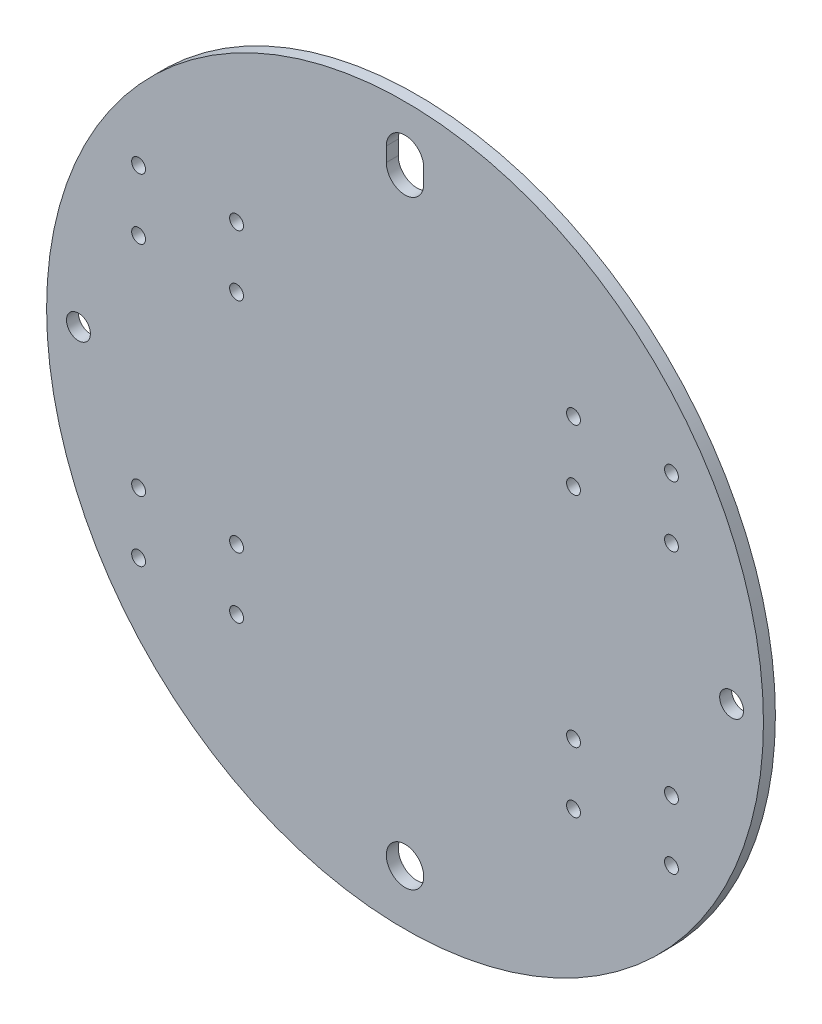
ISO-10303-21;
HEADER;
FILE_DESCRIPTION(('STEP AP214'),'2;1');
FILE_NAME('part.step','',(''),(''),'','','');
FILE_SCHEMA(('AUTOMOTIVE_DESIGN { 1 0 10303 214 1 1 1 1 }'));
ENDSEC;
DATA;
#1=APPLICATION_CONTEXT('core data for automotive mechanical design processes');
#2=APPLICATION_PROTOCOL_DEFINITION('international standard','automotive_design',2000,#1);
#3=PRODUCT_CONTEXT('',#1,'mechanical');
#4=PRODUCT('Part','Part','',(#3));
#5=PRODUCT_RELATED_PRODUCT_CATEGORY('part','',(#4));
#6=PRODUCT_DEFINITION_FORMATION('','',#4);
#7=PRODUCT_DEFINITION_CONTEXT('part definition',#1,'design');
#8=PRODUCT_DEFINITION('design','',#6,#7);
#9=PRODUCT_DEFINITION_SHAPE('','',#8);
#10=(LENGTH_UNIT() NAMED_UNIT(*) SI_UNIT(.MILLI.,.METRE.));
#11=(NAMED_UNIT(*) PLANE_ANGLE_UNIT() SI_UNIT($,.RADIAN.));
#12=(NAMED_UNIT(*) SI_UNIT($,.STERADIAN.) SOLID_ANGLE_UNIT());
#13=UNCERTAINTY_MEASURE_WITH_UNIT(LENGTH_MEASURE(1.E-05),#10,'distance_accuracy_value','');
#14=(GEOMETRIC_REPRESENTATION_CONTEXT(3) GLOBAL_UNCERTAINTY_ASSIGNED_CONTEXT((#13)) GLOBAL_UNIT_ASSIGNED_CONTEXT((#10,
#11,#12)) REPRESENTATION_CONTEXT('',''));
#15=CARTESIAN_POINT('',(0.,0.,0.));
#16=DIRECTION('',(0.,0.,1.));
#17=DIRECTION('',(1.,0.,0.));
#18=AXIS2_PLACEMENT_3D('',#15,#16,#17);
#19=CARTESIAN_POINT('',(0.,0.,4.));
#20=DIRECTION('',(0.,0.,1.));
#21=DIRECTION('',(1.,0.,0.));
#22=AXIS2_PLACEMENT_3D('',#19,#20,#21);
#23=PLANE('',#22);
#24=CARTESIAN_POINT('',(0.,-38.09697969257,4.));
#25=DIRECTION('',(0.,0.,1.));
#26=DIRECTION('',(1.,0.,0.));
#27=AXIS2_PLACEMENT_3D('',#24,#25,#26);
#28=CIRCLE('',#27,2.35);
#29=CARTESIAN_POINT('',(2.35,-38.09697969257,4.));
#30=VERTEX_POINT('',#29);
#31=EDGE_CURVE('E147',#30,#30,#28,.T.);
#32=ORIENTED_EDGE('',*,*,#31,.T.);
#33=EDGE_LOOP('',(#32));
#34=FACE_BOUND('',#33,.T.);
#35=CARTESIAN_POINT('',(0.,37.19697969257,4.));
#36=DIRECTION('',(0.,0.,1.));
#37=DIRECTION('',(1.,0.,0.));
#38=AXIS2_PLACEMENT_3D('',#35,#36,#37);
#39=CIRCLE('',#38,2.35);
#40=CARTESIAN_POINT('',(-2.35,37.19697969257,4.));
#41=VERTEX_POINT('',#40);
#42=CARTESIAN_POINT('',(2.35,37.19697969257,4.));
#43=VERTEX_POINT('',#42);
#44=EDGE_CURVE('E57',#41,#43,#39,.T.);
#45=ORIENTED_EDGE('',*,*,#44,.T.);
#46=DIRECTION('',(0.,1.,0.));
#47=VECTOR('',#46,1.);
#48=CARTESIAN_POINT('',(2.35,37.19697969257,4.));
#49=LINE('',#48,#47);
#50=CARTESIAN_POINT('',(2.35,38.99697969257,4.));
#51=VERTEX_POINT('',#50);
#52=EDGE_CURVE('E60',#43,#51,#49,.T.);
#53=ORIENTED_EDGE('',*,*,#52,.T.);
#54=CARTESIAN_POINT('',(0.,38.99697969257,4.));
#55=DIRECTION('',(0.,0.,1.));
#56=DIRECTION('',(1.,0.,0.));
#57=AXIS2_PLACEMENT_3D('',#54,#55,#56);
#58=CIRCLE('',#57,2.35);
#59=CARTESIAN_POINT('',(-2.35,38.99697969257,4.));
#60=VERTEX_POINT('',#59);
#61=EDGE_CURVE('E150',#51,#60,#58,.T.);
#62=ORIENTED_EDGE('',*,*,#61,.T.);
#63=DIRECTION('',(0.,1.,0.));
#64=VECTOR('',#63,1.);
#65=CARTESIAN_POINT('',(-2.35,38.99697969257,4.));
#66=LINE('',#65,#64);
#67=EDGE_CURVE('E55',#60,#41,#66,.F.);
#68=ORIENTED_EDGE('',*,*,#67,.T.);
#69=EDGE_LOOP('',(#45,#53,#62,#68));
#70=FACE_BOUND('',#69,.T.);
#71=CARTESIAN_POINT('',(-41.,0.,4.));
#72=DIRECTION('',(0.,0.,1.));
#73=DIRECTION('',(1.,0.,0.));
#74=AXIS2_PLACEMENT_3D('',#71,#72,#73);
#75=CIRCLE('',#74,1.5);
#76=CARTESIAN_POINT('',(-39.5,0.,4.));
#77=VERTEX_POINT('',#76);
#78=EDGE_CURVE('E73',#77,#77,#75,.T.);
#79=ORIENTED_EDGE('',*,*,#78,.T.);
#80=EDGE_LOOP('',(#79));
#81=FACE_BOUND('',#80,.T.);
#82=CARTESIAN_POINT('',(41.,0.,4.));
#83=DIRECTION('',(0.,0.,1.));
#84=DIRECTION('',(1.,0.,0.));
#85=AXIS2_PLACEMENT_3D('',#82,#83,#84);
#86=CIRCLE('',#85,1.5);
#87=CARTESIAN_POINT('',(42.5,0.,4.));
#88=VERTEX_POINT('',#87);
#89=EDGE_CURVE('E154',#88,#88,#86,.T.);
#90=ORIENTED_EDGE('',*,*,#89,.T.);
#91=EDGE_LOOP('',(#90));
#92=FACE_BOUND('',#91,.T.);
#93=CARTESIAN_POINT('',(-33.45,13.715,4.));
#94=DIRECTION('',(0.,0.,1.));
#95=DIRECTION('',(1.,0.,0.));
#96=AXIS2_PLACEMENT_3D('',#93,#94,#95);
#97=CIRCLE('',#96,0.87);
#98=CARTESIAN_POINT('',(-32.58,13.715,4.));
#99=VERTEX_POINT('',#98);
#100=EDGE_CURVE('E157',#99,#99,#97,.T.);
#101=ORIENTED_EDGE('',*,*,#100,.T.);
#102=EDGE_LOOP('',(#101));
#103=FACE_BOUND('',#102,.T.);
#104=CARTESIAN_POINT('',(-33.45,21.335,4.));
#105=DIRECTION('',(0.,0.,1.));
#106=DIRECTION('',(1.,0.,0.));
#107=AXIS2_PLACEMENT_3D('',#104,#105,#106);
#108=CIRCLE('',#107,0.87);
#109=CARTESIAN_POINT('',(-32.58,21.335,4.));
#110=VERTEX_POINT('',#109);
#111=EDGE_CURVE('E160',#110,#110,#108,.T.);
#112=ORIENTED_EDGE('',*,*,#111,.T.);
#113=EDGE_LOOP('',(#112));
#114=FACE_BOUND('',#113,.T.);
#115=CARTESIAN_POINT('',(-21.15,13.715,4.));
#116=DIRECTION('',(0.,0.,1.));
#117=DIRECTION('',(1.,0.,0.));
#118=AXIS2_PLACEMENT_3D('',#115,#116,#117);
#119=CIRCLE('',#118,0.87);
#120=CARTESIAN_POINT('',(-20.28,13.715,4.));
#121=VERTEX_POINT('',#120);
#122=EDGE_CURVE('E163',#121,#121,#119,.T.);
#123=ORIENTED_EDGE('',*,*,#122,.T.);
#124=EDGE_LOOP('',(#123));
#125=FACE_BOUND('',#124,.T.);
#126=CARTESIAN_POINT('',(-21.15,21.335,4.));
#127=DIRECTION('',(0.,0.,1.));
#128=DIRECTION('',(1.,0.,0.));
#129=AXIS2_PLACEMENT_3D('',#126,#127,#128);
#130=CIRCLE('',#129,0.87);
#131=CARTESIAN_POINT('',(-20.28,21.335,4.));
#132=VERTEX_POINT('',#131);
#133=EDGE_CURVE('E166',#132,#132,#130,.T.);
#134=ORIENTED_EDGE('',*,*,#133,.T.);
#135=EDGE_LOOP('',(#134));
#136=FACE_BOUND('',#135,.T.);
#137=CARTESIAN_POINT('',(-33.45,-13.715,4.));
#138=DIRECTION('',(0.,0.,1.));
#139=DIRECTION('',(1.,0.,0.));
#140=AXIS2_PLACEMENT_3D('',#137,#138,#139);
#141=CIRCLE('',#140,0.87);
#142=CARTESIAN_POINT('',(-32.58,-13.715,4.));
#143=VERTEX_POINT('',#142);
#144=EDGE_CURVE('E169',#143,#143,#141,.T.);
#145=ORIENTED_EDGE('',*,*,#144,.T.);
#146=EDGE_LOOP('',(#145));
#147=FACE_BOUND('',#146,.T.);
#148=CARTESIAN_POINT('',(-33.45,-21.335,4.));
#149=DIRECTION('',(0.,0.,1.));
#150=DIRECTION('',(1.,0.,0.));
#151=AXIS2_PLACEMENT_3D('',#148,#149,#150);
#152=CIRCLE('',#151,0.87);
#153=CARTESIAN_POINT('',(-32.58,-21.335,4.));
#154=VERTEX_POINT('',#153);
#155=EDGE_CURVE('E172',#154,#154,#152,.T.);
#156=ORIENTED_EDGE('',*,*,#155,.T.);
#157=EDGE_LOOP('',(#156));
#158=FACE_BOUND('',#157,.T.);
#159=CARTESIAN_POINT('',(-21.15,-13.715,4.));
#160=DIRECTION('',(0.,0.,1.));
#161=DIRECTION('',(1.,0.,0.));
#162=AXIS2_PLACEMENT_3D('',#159,#160,#161);
#163=CIRCLE('',#162,0.87);
#164=CARTESIAN_POINT('',(-20.28,-13.715,4.));
#165=VERTEX_POINT('',#164);
#166=EDGE_CURVE('E175',#165,#165,#163,.T.);
#167=ORIENTED_EDGE('',*,*,#166,.T.);
#168=EDGE_LOOP('',(#167));
#169=FACE_BOUND('',#168,.T.);
#170=CARTESIAN_POINT('',(-21.15,-21.335,4.));
#171=DIRECTION('',(0.,0.,1.));
#172=DIRECTION('',(1.,0.,0.));
#173=AXIS2_PLACEMENT_3D('',#170,#171,#172);
#174=CIRCLE('',#173,0.87);
#175=CARTESIAN_POINT('',(-20.28,-21.335,4.));
#176=VERTEX_POINT('',#175);
#177=EDGE_CURVE('E178',#176,#176,#174,.T.);
#178=ORIENTED_EDGE('',*,*,#177,.T.);
#179=EDGE_LOOP('',(#178));
#180=FACE_BOUND('',#179,.T.);
#181=CARTESIAN_POINT('',(33.45,13.715,4.));
#182=DIRECTION('',(0.,0.,1.));
#183=DIRECTION('',(1.,0.,0.));
#184=AXIS2_PLACEMENT_3D('',#181,#182,#183);
#185=CIRCLE('',#184,0.87);
#186=CARTESIAN_POINT('',(34.32,13.715,4.));
#187=VERTEX_POINT('',#186);
#188=EDGE_CURVE('E181',#187,#187,#185,.T.);
#189=ORIENTED_EDGE('',*,*,#188,.T.);
#190=EDGE_LOOP('',(#189));
#191=FACE_BOUND('',#190,.T.);
#192=CARTESIAN_POINT('',(33.45,21.335,4.));
#193=DIRECTION('',(0.,0.,1.));
#194=DIRECTION('',(1.,0.,0.));
#195=AXIS2_PLACEMENT_3D('',#192,#193,#194);
#196=CIRCLE('',#195,0.87);
#197=CARTESIAN_POINT('',(34.32,21.335,4.));
#198=VERTEX_POINT('',#197);
#199=EDGE_CURVE('E184',#198,#198,#196,.T.);
#200=ORIENTED_EDGE('',*,*,#199,.T.);
#201=EDGE_LOOP('',(#200));
#202=FACE_BOUND('',#201,.T.);
#203=CARTESIAN_POINT('',(21.15,13.715,4.));
#204=DIRECTION('',(0.,0.,1.));
#205=DIRECTION('',(1.,0.,0.));
#206=AXIS2_PLACEMENT_3D('',#203,#204,#205);
#207=CIRCLE('',#206,0.87);
#208=CARTESIAN_POINT('',(22.02,13.715,4.));
#209=VERTEX_POINT('',#208);
#210=EDGE_CURVE('E187',#209,#209,#207,.T.);
#211=ORIENTED_EDGE('',*,*,#210,.T.);
#212=EDGE_LOOP('',(#211));
#213=FACE_BOUND('',#212,.T.);
#214=CARTESIAN_POINT('',(21.15,21.335,4.));
#215=DIRECTION('',(0.,0.,1.));
#216=DIRECTION('',(1.,0.,0.));
#217=AXIS2_PLACEMENT_3D('',#214,#215,#216);
#218=CIRCLE('',#217,0.87);
#219=CARTESIAN_POINT('',(22.02,21.335,4.));
#220=VERTEX_POINT('',#219);
#221=EDGE_CURVE('E190',#220,#220,#218,.T.);
#222=ORIENTED_EDGE('',*,*,#221,.T.);
#223=EDGE_LOOP('',(#222));
#224=FACE_BOUND('',#223,.T.);
#225=CARTESIAN_POINT('',(33.45,-13.715,4.));
#226=DIRECTION('',(0.,0.,1.));
#227=DIRECTION('',(1.,0.,0.));
#228=AXIS2_PLACEMENT_3D('',#225,#226,#227);
#229=CIRCLE('',#228,0.87);
#230=CARTESIAN_POINT('',(34.32,-13.715,4.));
#231=VERTEX_POINT('',#230);
#232=EDGE_CURVE('E193',#231,#231,#229,.T.);
#233=ORIENTED_EDGE('',*,*,#232,.T.);
#234=EDGE_LOOP('',(#233));
#235=FACE_BOUND('',#234,.T.);
#236=CARTESIAN_POINT('',(33.45,-21.335,4.));
#237=DIRECTION('',(0.,0.,1.));
#238=DIRECTION('',(1.,0.,0.));
#239=AXIS2_PLACEMENT_3D('',#236,#237,#238);
#240=CIRCLE('',#239,0.87);
#241=CARTESIAN_POINT('',(34.32,-21.335,4.));
#242=VERTEX_POINT('',#241);
#243=EDGE_CURVE('E196',#242,#242,#240,.T.);
#244=ORIENTED_EDGE('',*,*,#243,.T.);
#245=EDGE_LOOP('',(#244));
#246=FACE_BOUND('',#245,.T.);
#247=CARTESIAN_POINT('',(21.15,-13.715,4.));
#248=DIRECTION('',(0.,0.,1.));
#249=DIRECTION('',(1.,0.,0.));
#250=AXIS2_PLACEMENT_3D('',#247,#248,#249);
#251=CIRCLE('',#250,0.87);
#252=CARTESIAN_POINT('',(22.02,-13.715,4.));
#253=VERTEX_POINT('',#252);
#254=EDGE_CURVE('E199',#253,#253,#251,.T.);
#255=ORIENTED_EDGE('',*,*,#254,.T.);
#256=EDGE_LOOP('',(#255));
#257=FACE_BOUND('',#256,.T.);
#258=CARTESIAN_POINT('',(21.15,-21.335,4.));
#259=DIRECTION('',(0.,0.,1.));
#260=DIRECTION('',(1.,0.,0.));
#261=AXIS2_PLACEMENT_3D('',#258,#259,#260);
#262=CIRCLE('',#261,0.87);
#263=CARTESIAN_POINT('',(22.02,-21.335,4.));
#264=VERTEX_POINT('',#263);
#265=EDGE_CURVE('E201',#264,#264,#262,.T.);
#266=ORIENTED_EDGE('',*,*,#265,.T.);
#267=EDGE_LOOP('',(#266));
#268=FACE_BOUND('',#267,.T.);
#269=CARTESIAN_POINT('',(0.,0.,4.));
#270=DIRECTION('',(0.,0.,1.));
#271=DIRECTION('',(1.,0.,0.));
#272=AXIS2_PLACEMENT_3D('',#269,#270,#271);
#273=CIRCLE('',#272,45.);
#274=CARTESIAN_POINT('',(45.,0.,4.));
#275=VERTEX_POINT('',#274);
#276=EDGE_CURVE('E20',#275,#275,#273,.T.);
#277=ORIENTED_EDGE('',*,*,#276,.F.);
#278=EDGE_LOOP('',(#277));
#279=FACE_BOUND('',#278,.T.);
#280=ADVANCED_FACE('F17',(#34,#70,#81,#92,#103,#114,#125,#136,#147,#158,#169,#180,#191,#202,
#213,#224,#235,#246,#257,#268,#279),#23,.F.);
#281=CARTESIAN_POINT('',(0.,0.,5.5));
#282=DIRECTION('',(0.,0.,1.));
#283=DIRECTION('',(1.,0.,0.));
#284=AXIS2_PLACEMENT_3D('',#281,#282,#283);
#285=CYLINDRICAL_SURFACE('',#284,45.);
#286=ORIENTED_EDGE('',*,*,#276,.T.);
#287=EDGE_LOOP('',(#286));
#288=FACE_BOUND('',#287,.T.);
#289=CARTESIAN_POINT('',(0.,0.,5.5));
#290=DIRECTION('',(0.,0.,1.));
#291=DIRECTION('',(1.,0.,0.));
#292=AXIS2_PLACEMENT_3D('',#289,#290,#291);
#293=CIRCLE('',#292,45.);
#294=CARTESIAN_POINT('',(45.,0.,5.5));
#295=VERTEX_POINT('',#294);
#296=EDGE_CURVE('E144',#295,#295,#293,.T.);
#297=ORIENTED_EDGE('',*,*,#296,.F.);
#298=EDGE_LOOP('',(#297));
#299=FACE_BOUND('',#298,.T.);
#300=ADVANCED_FACE('F208',(#288,#299),#285,.T.);
#301=CARTESIAN_POINT('',(21.15,-21.335,5.5));
#302=DIRECTION('',(0.,0.,1.));
#303=DIRECTION('',(1.,0.,0.));
#304=AXIS2_PLACEMENT_3D('',#301,#302,#303);
#305=CYLINDRICAL_SURFACE('',#304,0.87);
#306=ORIENTED_EDGE('',*,*,#265,.F.);
#307=EDGE_LOOP('',(#306));
#308=FACE_BOUND('',#307,.T.);
#309=CARTESIAN_POINT('',(21.15,-21.335,5.5));
#310=DIRECTION('',(0.,0.,1.));
#311=DIRECTION('',(1.,0.,0.));
#312=AXIS2_PLACEMENT_3D('',#309,#310,#311);
#313=CIRCLE('',#312,0.87);
#314=CARTESIAN_POINT('',(22.02,-21.335,5.5));
#315=VERTEX_POINT('',#314);
#316=EDGE_CURVE('E141',#315,#315,#313,.F.);
#317=ORIENTED_EDGE('',*,*,#316,.F.);
#318=EDGE_LOOP('',(#317));
#319=FACE_BOUND('',#318,.T.);
#320=ADVANCED_FACE('F217',(#308,#319),#305,.F.);
#321=CARTESIAN_POINT('',(21.15,-13.715,5.5));
#322=DIRECTION('',(0.,0.,1.));
#323=DIRECTION('',(1.,0.,0.));
#324=AXIS2_PLACEMENT_3D('',#321,#322,#323);
#325=CYLINDRICAL_SURFACE('',#324,0.87);
#326=ORIENTED_EDGE('',*,*,#254,.F.);
#327=EDGE_LOOP('',(#326));
#328=FACE_BOUND('',#327,.T.);
#329=CARTESIAN_POINT('',(21.15,-13.715,5.5));
#330=DIRECTION('',(0.,0.,1.));
#331=DIRECTION('',(1.,0.,0.));
#332=AXIS2_PLACEMENT_3D('',#329,#330,#331);
#333=CIRCLE('',#332,0.87);
#334=CARTESIAN_POINT('',(22.02,-13.715,5.5));
#335=VERTEX_POINT('',#334);
#336=EDGE_CURVE('E138',#335,#335,#333,.F.);
#337=ORIENTED_EDGE('',*,*,#336,.F.);
#338=EDGE_LOOP('',(#337));
#339=FACE_BOUND('',#338,.T.);
#340=ADVANCED_FACE('F304',(#328,#339),#325,.F.);
#341=CARTESIAN_POINT('',(33.45,-21.335,5.5));
#342=DIRECTION('',(0.,0.,1.));
#343=DIRECTION('',(1.,0.,0.));
#344=AXIS2_PLACEMENT_3D('',#341,#342,#343);
#345=CYLINDRICAL_SURFACE('',#344,0.87);
#346=ORIENTED_EDGE('',*,*,#243,.F.);
#347=EDGE_LOOP('',(#346));
#348=FACE_BOUND('',#347,.T.);
#349=CARTESIAN_POINT('',(33.45,-21.335,5.5));
#350=DIRECTION('',(0.,0.,1.));
#351=DIRECTION('',(1.,0.,0.));
#352=AXIS2_PLACEMENT_3D('',#349,#350,#351);
#353=CIRCLE('',#352,0.87);
#354=CARTESIAN_POINT('',(34.32,-21.335,5.5));
#355=VERTEX_POINT('',#354);
#356=EDGE_CURVE('E135',#355,#355,#353,.F.);
#357=ORIENTED_EDGE('',*,*,#356,.F.);
#358=EDGE_LOOP('',(#357));
#359=FACE_BOUND('',#358,.T.);
#360=ADVANCED_FACE('F300',(#348,#359),#345,.F.);
#361=CARTESIAN_POINT('',(33.45,-13.715,5.5));
#362=DIRECTION('',(0.,0.,1.));
#363=DIRECTION('',(1.,0.,0.));
#364=AXIS2_PLACEMENT_3D('',#361,#362,#363);
#365=CYLINDRICAL_SURFACE('',#364,0.87);
#366=ORIENTED_EDGE('',*,*,#232,.F.);
#367=EDGE_LOOP('',(#366));
#368=FACE_BOUND('',#367,.T.);
#369=CARTESIAN_POINT('',(33.45,-13.715,5.5));
#370=DIRECTION('',(0.,0.,1.));
#371=DIRECTION('',(1.,0.,0.));
#372=AXIS2_PLACEMENT_3D('',#369,#370,#371);
#373=CIRCLE('',#372,0.87);
#374=CARTESIAN_POINT('',(34.32,-13.715,5.5));
#375=VERTEX_POINT('',#374);
#376=EDGE_CURVE('E132',#375,#375,#373,.F.);
#377=ORIENTED_EDGE('',*,*,#376,.F.);
#378=EDGE_LOOP('',(#377));
#379=FACE_BOUND('',#378,.T.);
#380=ADVANCED_FACE('F296',(#368,#379),#365,.F.);
#381=CARTESIAN_POINT('',(21.15,21.335,5.5));
#382=DIRECTION('',(0.,0.,1.));
#383=DIRECTION('',(1.,0.,0.));
#384=AXIS2_PLACEMENT_3D('',#381,#382,#383);
#385=CYLINDRICAL_SURFACE('',#384,0.87);
#386=ORIENTED_EDGE('',*,*,#221,.F.);
#387=EDGE_LOOP('',(#386));
#388=FACE_BOUND('',#387,.T.);
#389=CARTESIAN_POINT('',(21.15,21.335,5.5));
#390=DIRECTION('',(0.,0.,1.));
#391=DIRECTION('',(1.,0.,0.));
#392=AXIS2_PLACEMENT_3D('',#389,#390,#391);
#393=CIRCLE('',#392,0.87);
#394=CARTESIAN_POINT('',(22.02,21.335,5.5));
#395=VERTEX_POINT('',#394);
#396=EDGE_CURVE('E129',#395,#395,#393,.F.);
#397=ORIENTED_EDGE('',*,*,#396,.F.);
#398=EDGE_LOOP('',(#397));
#399=FACE_BOUND('',#398,.T.);
#400=ADVANCED_FACE('F292',(#388,#399),#385,.F.);
#401=CARTESIAN_POINT('',(21.15,13.715,5.5));
#402=DIRECTION('',(0.,0.,1.));
#403=DIRECTION('',(1.,0.,0.));
#404=AXIS2_PLACEMENT_3D('',#401,#402,#403);
#405=CYLINDRICAL_SURFACE('',#404,0.87);
#406=ORIENTED_EDGE('',*,*,#210,.F.);
#407=EDGE_LOOP('',(#406));
#408=FACE_BOUND('',#407,.T.);
#409=CARTESIAN_POINT('',(21.15,13.715,5.5));
#410=DIRECTION('',(0.,0.,1.));
#411=DIRECTION('',(1.,0.,0.));
#412=AXIS2_PLACEMENT_3D('',#409,#410,#411);
#413=CIRCLE('',#412,0.87);
#414=CARTESIAN_POINT('',(22.02,13.715,5.5));
#415=VERTEX_POINT('',#414);
#416=EDGE_CURVE('E126',#415,#415,#413,.F.);
#417=ORIENTED_EDGE('',*,*,#416,.F.);
#418=EDGE_LOOP('',(#417));
#419=FACE_BOUND('',#418,.T.);
#420=ADVANCED_FACE('F288',(#408,#419),#405,.F.);
#421=CARTESIAN_POINT('',(33.45,21.335,5.5));
#422=DIRECTION('',(0.,0.,1.));
#423=DIRECTION('',(1.,0.,0.));
#424=AXIS2_PLACEMENT_3D('',#421,#422,#423);
#425=CYLINDRICAL_SURFACE('',#424,0.87);
#426=ORIENTED_EDGE('',*,*,#199,.F.);
#427=EDGE_LOOP('',(#426));
#428=FACE_BOUND('',#427,.T.);
#429=CARTESIAN_POINT('',(33.45,21.335,5.5));
#430=DIRECTION('',(0.,0.,1.));
#431=DIRECTION('',(1.,0.,0.));
#432=AXIS2_PLACEMENT_3D('',#429,#430,#431);
#433=CIRCLE('',#432,0.87);
#434=CARTESIAN_POINT('',(34.32,21.335,5.5));
#435=VERTEX_POINT('',#434);
#436=EDGE_CURVE('E123',#435,#435,#433,.F.);
#437=ORIENTED_EDGE('',*,*,#436,.F.);
#438=EDGE_LOOP('',(#437));
#439=FACE_BOUND('',#438,.T.);
#440=ADVANCED_FACE('F284',(#428,#439),#425,.F.);
#441=CARTESIAN_POINT('',(33.45,13.715,5.5));
#442=DIRECTION('',(0.,0.,1.));
#443=DIRECTION('',(1.,0.,0.));
#444=AXIS2_PLACEMENT_3D('',#441,#442,#443);
#445=CYLINDRICAL_SURFACE('',#444,0.87);
#446=ORIENTED_EDGE('',*,*,#188,.F.);
#447=EDGE_LOOP('',(#446));
#448=FACE_BOUND('',#447,.T.);
#449=CARTESIAN_POINT('',(33.45,13.715,5.5));
#450=DIRECTION('',(0.,0.,1.));
#451=DIRECTION('',(1.,0.,0.));
#452=AXIS2_PLACEMENT_3D('',#449,#450,#451);
#453=CIRCLE('',#452,0.87);
#454=CARTESIAN_POINT('',(34.32,13.715,5.5));
#455=VERTEX_POINT('',#454);
#456=EDGE_CURVE('E120',#455,#455,#453,.F.);
#457=ORIENTED_EDGE('',*,*,#456,.F.);
#458=EDGE_LOOP('',(#457));
#459=FACE_BOUND('',#458,.T.);
#460=ADVANCED_FACE('F280',(#448,#459),#445,.F.);
#461=CARTESIAN_POINT('',(-21.15,-21.335,5.5));
#462=DIRECTION('',(0.,0.,1.));
#463=DIRECTION('',(1.,0.,0.));
#464=AXIS2_PLACEMENT_3D('',#461,#462,#463);
#465=CYLINDRICAL_SURFACE('',#464,0.87);
#466=ORIENTED_EDGE('',*,*,#177,.F.);
#467=EDGE_LOOP('',(#466));
#468=FACE_BOUND('',#467,.T.);
#469=CARTESIAN_POINT('',(-21.15,-21.335,5.5));
#470=DIRECTION('',(0.,0.,1.));
#471=DIRECTION('',(1.,0.,0.));
#472=AXIS2_PLACEMENT_3D('',#469,#470,#471);
#473=CIRCLE('',#472,0.87);
#474=CARTESIAN_POINT('',(-20.28,-21.335,5.5));
#475=VERTEX_POINT('',#474);
#476=EDGE_CURVE('E117',#475,#475,#473,.F.);
#477=ORIENTED_EDGE('',*,*,#476,.F.);
#478=EDGE_LOOP('',(#477));
#479=FACE_BOUND('',#478,.T.);
#480=ADVANCED_FACE('F276',(#468,#479),#465,.F.);
#481=CARTESIAN_POINT('',(-21.15,-13.715,5.5));
#482=DIRECTION('',(0.,0.,1.));
#483=DIRECTION('',(1.,0.,0.));
#484=AXIS2_PLACEMENT_3D('',#481,#482,#483);
#485=CYLINDRICAL_SURFACE('',#484,0.87);
#486=ORIENTED_EDGE('',*,*,#166,.F.);
#487=EDGE_LOOP('',(#486));
#488=FACE_BOUND('',#487,.T.);
#489=CARTESIAN_POINT('',(-21.15,-13.715,5.5));
#490=DIRECTION('',(0.,0.,1.));
#491=DIRECTION('',(1.,0.,0.));
#492=AXIS2_PLACEMENT_3D('',#489,#490,#491);
#493=CIRCLE('',#492,0.87);
#494=CARTESIAN_POINT('',(-20.28,-13.715,5.5));
#495=VERTEX_POINT('',#494);
#496=EDGE_CURVE('E114',#495,#495,#493,.F.);
#497=ORIENTED_EDGE('',*,*,#496,.F.);
#498=EDGE_LOOP('',(#497));
#499=FACE_BOUND('',#498,.T.);
#500=ADVANCED_FACE('F272',(#488,#499),#485,.F.);
#501=CARTESIAN_POINT('',(-33.45,-21.335,5.5));
#502=DIRECTION('',(0.,0.,1.));
#503=DIRECTION('',(1.,0.,0.));
#504=AXIS2_PLACEMENT_3D('',#501,#502,#503);
#505=CYLINDRICAL_SURFACE('',#504,0.87);
#506=ORIENTED_EDGE('',*,*,#155,.F.);
#507=EDGE_LOOP('',(#506));
#508=FACE_BOUND('',#507,.T.);
#509=CARTESIAN_POINT('',(-33.45,-21.335,5.5));
#510=DIRECTION('',(0.,0.,1.));
#511=DIRECTION('',(1.,0.,0.));
#512=AXIS2_PLACEMENT_3D('',#509,#510,#511);
#513=CIRCLE('',#512,0.87);
#514=CARTESIAN_POINT('',(-32.58,-21.335,5.5));
#515=VERTEX_POINT('',#514);
#516=EDGE_CURVE('E111',#515,#515,#513,.F.);
#517=ORIENTED_EDGE('',*,*,#516,.F.);
#518=EDGE_LOOP('',(#517));
#519=FACE_BOUND('',#518,.T.);
#520=ADVANCED_FACE('F268',(#508,#519),#505,.F.);
#521=CARTESIAN_POINT('',(-33.45,-13.715,5.5));
#522=DIRECTION('',(0.,0.,1.));
#523=DIRECTION('',(1.,0.,0.));
#524=AXIS2_PLACEMENT_3D('',#521,#522,#523);
#525=CYLINDRICAL_SURFACE('',#524,0.87);
#526=ORIENTED_EDGE('',*,*,#144,.F.);
#527=EDGE_LOOP('',(#526));
#528=FACE_BOUND('',#527,.T.);
#529=CARTESIAN_POINT('',(-33.45,-13.715,5.5));
#530=DIRECTION('',(0.,0.,1.));
#531=DIRECTION('',(1.,0.,0.));
#532=AXIS2_PLACEMENT_3D('',#529,#530,#531);
#533=CIRCLE('',#532,0.87);
#534=CARTESIAN_POINT('',(-32.58,-13.715,5.5));
#535=VERTEX_POINT('',#534);
#536=EDGE_CURVE('E108',#535,#535,#533,.F.);
#537=ORIENTED_EDGE('',*,*,#536,.F.);
#538=EDGE_LOOP('',(#537));
#539=FACE_BOUND('',#538,.T.);
#540=ADVANCED_FACE('F264',(#528,#539),#525,.F.);
#541=CARTESIAN_POINT('',(-21.15,21.335,5.5));
#542=DIRECTION('',(0.,0.,1.));
#543=DIRECTION('',(1.,0.,0.));
#544=AXIS2_PLACEMENT_3D('',#541,#542,#543);
#545=CYLINDRICAL_SURFACE('',#544,0.87);
#546=ORIENTED_EDGE('',*,*,#133,.F.);
#547=EDGE_LOOP('',(#546));
#548=FACE_BOUND('',#547,.T.);
#549=CARTESIAN_POINT('',(-21.15,21.335,5.5));
#550=DIRECTION('',(0.,0.,1.));
#551=DIRECTION('',(1.,0.,0.));
#552=AXIS2_PLACEMENT_3D('',#549,#550,#551);
#553=CIRCLE('',#552,0.87);
#554=CARTESIAN_POINT('',(-20.28,21.335,5.5));
#555=VERTEX_POINT('',#554);
#556=EDGE_CURVE('E105',#555,#555,#553,.F.);
#557=ORIENTED_EDGE('',*,*,#556,.F.);
#558=EDGE_LOOP('',(#557));
#559=FACE_BOUND('',#558,.T.);
#560=ADVANCED_FACE('F260',(#548,#559),#545,.F.);
#561=CARTESIAN_POINT('',(-21.15,13.715,5.5));
#562=DIRECTION('',(0.,0.,1.));
#563=DIRECTION('',(1.,0.,0.));
#564=AXIS2_PLACEMENT_3D('',#561,#562,#563);
#565=CYLINDRICAL_SURFACE('',#564,0.87);
#566=ORIENTED_EDGE('',*,*,#122,.F.);
#567=EDGE_LOOP('',(#566));
#568=FACE_BOUND('',#567,.T.);
#569=CARTESIAN_POINT('',(-21.15,13.715,5.5));
#570=DIRECTION('',(0.,0.,1.));
#571=DIRECTION('',(1.,0.,0.));
#572=AXIS2_PLACEMENT_3D('',#569,#570,#571);
#573=CIRCLE('',#572,0.87);
#574=CARTESIAN_POINT('',(-20.28,13.715,5.5));
#575=VERTEX_POINT('',#574);
#576=EDGE_CURVE('E102',#575,#575,#573,.F.);
#577=ORIENTED_EDGE('',*,*,#576,.F.);
#578=EDGE_LOOP('',(#577));
#579=FACE_BOUND('',#578,.T.);
#580=ADVANCED_FACE('F256',(#568,#579),#565,.F.);
#581=CARTESIAN_POINT('',(-33.45,21.335,5.5));
#582=DIRECTION('',(0.,0.,1.));
#583=DIRECTION('',(1.,0.,0.));
#584=AXIS2_PLACEMENT_3D('',#581,#582,#583);
#585=CYLINDRICAL_SURFACE('',#584,0.87);
#586=ORIENTED_EDGE('',*,*,#111,.F.);
#587=EDGE_LOOP('',(#586));
#588=FACE_BOUND('',#587,.T.);
#589=CARTESIAN_POINT('',(-33.45,21.335,5.5));
#590=DIRECTION('',(0.,0.,1.));
#591=DIRECTION('',(1.,0.,0.));
#592=AXIS2_PLACEMENT_3D('',#589,#590,#591);
#593=CIRCLE('',#592,0.87);
#594=CARTESIAN_POINT('',(-32.58,21.335,5.5));
#595=VERTEX_POINT('',#594);
#596=EDGE_CURVE('E99',#595,#595,#593,.F.);
#597=ORIENTED_EDGE('',*,*,#596,.F.);
#598=EDGE_LOOP('',(#597));
#599=FACE_BOUND('',#598,.T.);
#600=ADVANCED_FACE('F252',(#588,#599),#585,.F.);
#601=CARTESIAN_POINT('',(-33.45,13.715,5.5));
#602=DIRECTION('',(0.,0.,1.));
#603=DIRECTION('',(1.,0.,0.));
#604=AXIS2_PLACEMENT_3D('',#601,#602,#603);
#605=CYLINDRICAL_SURFACE('',#604,0.87);
#606=ORIENTED_EDGE('',*,*,#100,.F.);
#607=EDGE_LOOP('',(#606));
#608=FACE_BOUND('',#607,.T.);
#609=CARTESIAN_POINT('',(-33.45,13.715,5.5));
#610=DIRECTION('',(0.,0.,1.));
#611=DIRECTION('',(1.,0.,0.));
#612=AXIS2_PLACEMENT_3D('',#609,#610,#611);
#613=CIRCLE('',#612,0.87);
#614=CARTESIAN_POINT('',(-32.58,13.715,5.5));
#615=VERTEX_POINT('',#614);
#616=EDGE_CURVE('E96',#615,#615,#613,.F.);
#617=ORIENTED_EDGE('',*,*,#616,.F.);
#618=EDGE_LOOP('',(#617));
#619=FACE_BOUND('',#618,.T.);
#620=ADVANCED_FACE('F248',(#608,#619),#605,.F.);
#621=CARTESIAN_POINT('',(41.,0.,8.5));
#622=DIRECTION('',(0.,0.,1.));
#623=DIRECTION('',(1.,0.,0.));
#624=AXIS2_PLACEMENT_3D('',#621,#622,#623);
#625=CYLINDRICAL_SURFACE('',#624,1.5);
#626=ORIENTED_EDGE('',*,*,#89,.F.);
#627=EDGE_LOOP('',(#626));
#628=FACE_BOUND('',#627,.T.);
#629=CARTESIAN_POINT('',(41.,0.,5.5));
#630=DIRECTION('',(0.,0.,1.));
#631=DIRECTION('',(1.,0.,0.));
#632=AXIS2_PLACEMENT_3D('',#629,#630,#631);
#633=CIRCLE('',#632,1.5);
#634=CARTESIAN_POINT('',(42.5,0.,5.5));
#635=VERTEX_POINT('',#634);
#636=EDGE_CURVE('E93',#635,#635,#633,.F.);
#637=ORIENTED_EDGE('',*,*,#636,.F.);
#638=EDGE_LOOP('',(#637));
#639=FACE_BOUND('',#638,.T.);
#640=ADVANCED_FACE('F244',(#628,#639),#625,.F.);
#641=CARTESIAN_POINT('',(-41.,0.,8.5));
#642=DIRECTION('',(0.,0.,1.));
#643=DIRECTION('',(1.,0.,0.));
#644=AXIS2_PLACEMENT_3D('',#641,#642,#643);
#645=CYLINDRICAL_SURFACE('',#644,1.5);
#646=ORIENTED_EDGE('',*,*,#78,.F.);
#647=EDGE_LOOP('',(#646));
#648=FACE_BOUND('',#647,.T.);
#649=CARTESIAN_POINT('',(-41.,0.,5.5));
#650=DIRECTION('',(0.,0.,1.));
#651=DIRECTION('',(1.,0.,0.));
#652=AXIS2_PLACEMENT_3D('',#649,#650,#651);
#653=CIRCLE('',#652,1.5);
#654=CARTESIAN_POINT('',(-39.5,0.,5.5));
#655=VERTEX_POINT('',#654);
#656=EDGE_CURVE('E90',#655,#655,#653,.F.);
#657=ORIENTED_EDGE('',*,*,#656,.F.);
#658=EDGE_LOOP('',(#657));
#659=FACE_BOUND('',#658,.T.);
#660=ADVANCED_FACE('F241',(#648,#659),#645,.F.);
#661=CARTESIAN_POINT('',(2.35,37.19697969257,8.5));
#662=DIRECTION('',(1.,0.,0.));
#663=DIRECTION('',(0.,0.,-1.));
#664=AXIS2_PLACEMENT_3D('',#661,#662,#663);
#665=PLANE('',#664);
#666=ORIENTED_EDGE('',*,*,#52,.F.);
#667=DIRECTION('',(0.,0.,1.));
#668=VECTOR('',#667,1.);
#669=CARTESIAN_POINT('',(2.35,37.19697969257,8.5));
#670=LINE('',#669,#668);
#671=CARTESIAN_POINT('',(2.35,37.19697969257,5.5));
#672=VERTEX_POINT('',#671);
#673=EDGE_CURVE('E65',#43,#672,#670,.T.);
#674=ORIENTED_EDGE('',*,*,#673,.T.);
#675=DIRECTION('',(0.,1.,0.));
#676=VECTOR('',#675,1.);
#677=CARTESIAN_POINT('',(2.35,0.,5.5));
#678=LINE('',#677,#676);
#679=CARTESIAN_POINT('',(2.35,38.99697969257,5.5));
#680=VERTEX_POINT('',#679);
#681=EDGE_CURVE('E89',#680,#672,#678,.F.);
#682=ORIENTED_EDGE('',*,*,#681,.F.);
#683=DIRECTION('',(0.,0.,1.));
#684=VECTOR('',#683,1.);
#685=CARTESIAN_POINT('',(2.35,38.99697969257,8.5));
#686=LINE('',#685,#684);
#687=EDGE_CURVE('E71',#680,#51,#686,.F.);
#688=ORIENTED_EDGE('',*,*,#687,.T.);
#689=EDGE_LOOP('',(#666,#674,#682,#688));
#690=FACE_BOUND('',#689,.T.);
#691=ADVANCED_FACE('F68',(#690),#665,.F.);
#692=CARTESIAN_POINT('',(0.,37.19697969257,8.5));
#693=DIRECTION('',(0.,0.,1.));
#694=DIRECTION('',(1.,0.,0.));
#695=AXIS2_PLACEMENT_3D('',#692,#693,#694);
#696=CYLINDRICAL_SURFACE('',#695,2.35);
#697=ORIENTED_EDGE('',*,*,#44,.F.);
#698=DIRECTION('',(0.,0.,1.));
#699=VECTOR('',#698,1.);
#700=CARTESIAN_POINT('',(-2.35,37.19697969257,8.5));
#701=LINE('',#700,#699);
#702=CARTESIAN_POINT('',(-2.35,37.19697969257,5.5));
#703=VERTEX_POINT('',#702);
#704=EDGE_CURVE('E80',#41,#703,#701,.T.);
#705=ORIENTED_EDGE('',*,*,#704,.T.);
#706=CARTESIAN_POINT('',(0.,37.19697969257,5.5));
#707=DIRECTION('',(0.,0.,1.));
#708=DIRECTION('',(1.,0.,0.));
#709=AXIS2_PLACEMENT_3D('',#706,#707,#708);
#710=CIRCLE('',#709,2.35);
#711=EDGE_CURVE('E77',#672,#703,#710,.F.);
#712=ORIENTED_EDGE('',*,*,#711,.F.);
#713=ORIENTED_EDGE('',*,*,#673,.F.);
#714=EDGE_LOOP('',(#697,#705,#712,#713));
#715=FACE_BOUND('',#714,.T.);
#716=ADVANCED_FACE('F75',(#715),#696,.F.);
#717=CARTESIAN_POINT('',(-2.35,38.99697969257,8.5));
#718=DIRECTION('',(-1.,0.,0.));
#719=DIRECTION('',(0.,0.,1.));
#720=AXIS2_PLACEMENT_3D('',#717,#718,#719);
#721=PLANE('',#720);
#722=ORIENTED_EDGE('',*,*,#67,.F.);
#723=DIRECTION('',(0.,0.,1.));
#724=VECTOR('',#723,1.);
#725=CARTESIAN_POINT('',(-2.35,38.99697969257,8.5));
#726=LINE('',#725,#724);
#727=CARTESIAN_POINT('',(-2.35,38.99697969257,5.5));
#728=VERTEX_POINT('',#727);
#729=EDGE_CURVE('E35',#60,#728,#726,.T.);
#730=ORIENTED_EDGE('',*,*,#729,.T.);
#731=DIRECTION('',(0.,1.,0.));
#732=VECTOR('',#731,1.);
#733=CARTESIAN_POINT('',(-2.35,0.,5.5));
#734=LINE('',#733,#732);
#735=EDGE_CURVE('E87',#703,#728,#734,.T.);
#736=ORIENTED_EDGE('',*,*,#735,.F.);
#737=ORIENTED_EDGE('',*,*,#704,.F.);
#738=EDGE_LOOP('',(#722,#730,#736,#737));
#739=FACE_BOUND('',#738,.T.);
#740=ADVANCED_FACE('F233',(#739),#721,.F.);
#741=CARTESIAN_POINT('',(0.,38.99697969257,8.5));
#742=DIRECTION('',(0.,0.,1.));
#743=DIRECTION('',(1.,0.,0.));
#744=AXIS2_PLACEMENT_3D('',#741,#742,#743);
#745=CYLINDRICAL_SURFACE('',#744,2.35);
#746=ORIENTED_EDGE('',*,*,#61,.F.);
#747=ORIENTED_EDGE('',*,*,#687,.F.);
#748=CARTESIAN_POINT('',(0.,38.99697969257,5.5));
#749=DIRECTION('',(0.,0.,1.));
#750=DIRECTION('',(1.,0.,0.));
#751=AXIS2_PLACEMENT_3D('',#748,#749,#750);
#752=CIRCLE('',#751,2.35);
#753=EDGE_CURVE('E26',#728,#680,#752,.F.);
#754=ORIENTED_EDGE('',*,*,#753,.F.);
#755=ORIENTED_EDGE('',*,*,#729,.F.);
#756=EDGE_LOOP('',(#746,#747,#754,#755));
#757=FACE_BOUND('',#756,.T.);
#758=ADVANCED_FACE('F226',(#757),#745,.F.);
#759=CARTESIAN_POINT('',(0.,-38.09697969257,8.5));
#760=DIRECTION('',(0.,0.,1.));
#761=DIRECTION('',(1.,0.,0.));
#762=AXIS2_PLACEMENT_3D('',#759,#760,#761);
#763=CYLINDRICAL_SURFACE('',#762,2.35);
#764=ORIENTED_EDGE('',*,*,#31,.F.);
#765=EDGE_LOOP('',(#764));
#766=FACE_BOUND('',#765,.T.);
#767=CARTESIAN_POINT('',(0.,-38.09697969257,5.5));
#768=DIRECTION('',(0.,0.,1.));
#769=DIRECTION('',(1.,0.,0.));
#770=AXIS2_PLACEMENT_3D('',#767,#768,#769);
#771=CIRCLE('',#770,2.35);
#772=CARTESIAN_POINT('',(2.35,-38.09697969257,5.5));
#773=VERTEX_POINT('',#772);
#774=EDGE_CURVE('E11',#773,#773,#771,.F.);
#775=ORIENTED_EDGE('',*,*,#774,.F.);
#776=EDGE_LOOP('',(#775));
#777=FACE_BOUND('',#776,.T.);
#778=ADVANCED_FACE('F220',(#766,#777),#763,.F.);
#779=CARTESIAN_POINT('',(0.,0.,5.5));
#780=DIRECTION('',(0.,0.,1.));
#781=DIRECTION('',(1.,0.,0.));
#782=AXIS2_PLACEMENT_3D('',#779,#780,#781);
#783=PLANE('',#782);
#784=ORIENTED_EDGE('',*,*,#774,.T.);
#785=EDGE_LOOP('',(#784));
#786=FACE_BOUND('',#785,.T.);
#787=ORIENTED_EDGE('',*,*,#735,.T.);
#788=ORIENTED_EDGE('',*,*,#753,.T.);
#789=ORIENTED_EDGE('',*,*,#681,.T.);
#790=ORIENTED_EDGE('',*,*,#711,.T.);
#791=EDGE_LOOP('',(#787,#788,#789,#790));
#792=FACE_BOUND('',#791,.T.);
#793=ORIENTED_EDGE('',*,*,#656,.T.);
#794=EDGE_LOOP('',(#793));
#795=FACE_BOUND('',#794,.T.);
#796=ORIENTED_EDGE('',*,*,#636,.T.);
#797=EDGE_LOOP('',(#796));
#798=FACE_BOUND('',#797,.T.);
#799=ORIENTED_EDGE('',*,*,#616,.T.);
#800=EDGE_LOOP('',(#799));
#801=FACE_BOUND('',#800,.T.);
#802=ORIENTED_EDGE('',*,*,#596,.T.);
#803=EDGE_LOOP('',(#802));
#804=FACE_BOUND('',#803,.T.);
#805=ORIENTED_EDGE('',*,*,#576,.T.);
#806=EDGE_LOOP('',(#805));
#807=FACE_BOUND('',#806,.T.);
#808=ORIENTED_EDGE('',*,*,#556,.T.);
#809=EDGE_LOOP('',(#808));
#810=FACE_BOUND('',#809,.T.);
#811=ORIENTED_EDGE('',*,*,#536,.T.);
#812=EDGE_LOOP('',(#811));
#813=FACE_BOUND('',#812,.T.);
#814=ORIENTED_EDGE('',*,*,#516,.T.);
#815=EDGE_LOOP('',(#814));
#816=FACE_BOUND('',#815,.T.);
#817=ORIENTED_EDGE('',*,*,#496,.T.);
#818=EDGE_LOOP('',(#817));
#819=FACE_BOUND('',#818,.T.);
#820=ORIENTED_EDGE('',*,*,#476,.T.);
#821=EDGE_LOOP('',(#820));
#822=FACE_BOUND('',#821,.T.);
#823=ORIENTED_EDGE('',*,*,#456,.T.);
#824=EDGE_LOOP('',(#823));
#825=FACE_BOUND('',#824,.T.);
#826=ORIENTED_EDGE('',*,*,#436,.T.);
#827=EDGE_LOOP('',(#826));
#828=FACE_BOUND('',#827,.T.);
#829=ORIENTED_EDGE('',*,*,#416,.T.);
#830=EDGE_LOOP('',(#829));
#831=FACE_BOUND('',#830,.T.);
#832=ORIENTED_EDGE('',*,*,#396,.T.);
#833=EDGE_LOOP('',(#832));
#834=FACE_BOUND('',#833,.T.);
#835=ORIENTED_EDGE('',*,*,#376,.T.);
#836=EDGE_LOOP('',(#835));
#837=FACE_BOUND('',#836,.T.);
#838=ORIENTED_EDGE('',*,*,#356,.T.);
#839=EDGE_LOOP('',(#838));
#840=FACE_BOUND('',#839,.T.);
#841=ORIENTED_EDGE('',*,*,#336,.T.);
#842=EDGE_LOOP('',(#841));
#843=FACE_BOUND('',#842,.T.);
#844=ORIENTED_EDGE('',*,*,#316,.T.);
#845=EDGE_LOOP('',(#844));
#846=FACE_BOUND('',#845,.T.);
#847=ORIENTED_EDGE('',*,*,#296,.T.);
#848=EDGE_LOOP('',(#847));
#849=FACE_BOUND('',#848,.T.);
#850=ADVANCED_FACE('F218',(#786,#792,#795,#798,#801,#804,#807,#810,#813,#816,#819,#822,#825,
#828,#831,#834,#837,#840,#843,#846,#849),#783,.T.);
#851=CLOSED_SHELL('',(#280,#300,#320,#340,#360,#380,#400,#420,#440,#460,#480,#500,#520,#540,
#560,#580,#600,#620,#640,#660,#691,#716,#740,#758,#778,#850));
#852=MANIFOLD_SOLID_BREP('B1',#851);
#853=ADVANCED_BREP_SHAPE_REPRESENTATION('',(#18,#852),#14);
#854=SHAPE_DEFINITION_REPRESENTATION(#9,#853);
ENDSEC;
END-ISO-10303-21;
